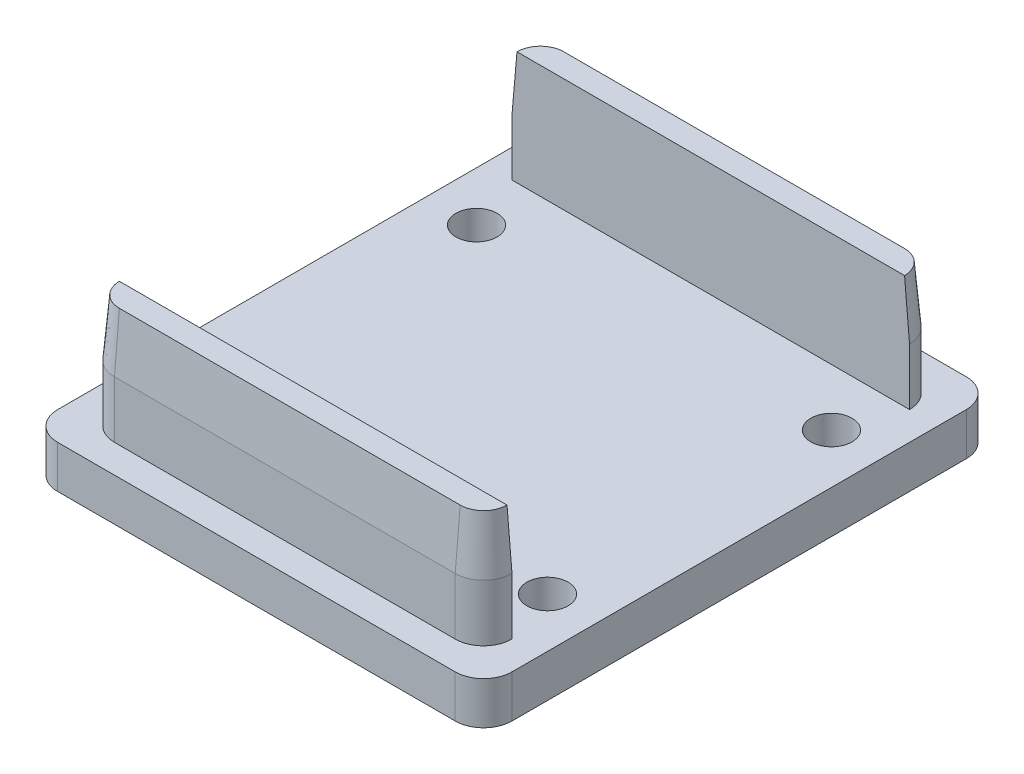
ISO-10303-21;
HEADER;
FILE_DESCRIPTION(('STEP AP214'),'2;1');
FILE_NAME('part.step','',(''),(''),'','','');
FILE_SCHEMA(('AUTOMOTIVE_DESIGN { 1 0 10303 214 1 1 1 1 }'));
ENDSEC;
DATA;
#1=APPLICATION_CONTEXT('core data for automotive mechanical design processes');
#2=APPLICATION_PROTOCOL_DEFINITION('international standard','automotive_design',2000,#1);
#3=PRODUCT_CONTEXT('',#1,'mechanical');
#4=PRODUCT('Part','Part','',(#3));
#5=PRODUCT_RELATED_PRODUCT_CATEGORY('part','',(#4));
#6=PRODUCT_DEFINITION_FORMATION('','',#4);
#7=PRODUCT_DEFINITION_CONTEXT('part definition',#1,'design');
#8=PRODUCT_DEFINITION('design','',#6,#7);
#9=PRODUCT_DEFINITION_SHAPE('','',#8);
#10=(LENGTH_UNIT() NAMED_UNIT(*) SI_UNIT(.MILLI.,.METRE.));
#11=(NAMED_UNIT(*) PLANE_ANGLE_UNIT() SI_UNIT($,.RADIAN.));
#12=(NAMED_UNIT(*) SI_UNIT($,.STERADIAN.) SOLID_ANGLE_UNIT());
#13=UNCERTAINTY_MEASURE_WITH_UNIT(LENGTH_MEASURE(1.E-05),#10,'distance_accuracy_value','');
#14=(GEOMETRIC_REPRESENTATION_CONTEXT(3) GLOBAL_UNCERTAINTY_ASSIGNED_CONTEXT((#13)) GLOBAL_UNIT_ASSIGNED_CONTEXT((#10,
#11,#12)) REPRESENTATION_CONTEXT('',''));
#15=CARTESIAN_POINT('',(0.,0.,0.));
#16=DIRECTION('',(0.,0.,1.));
#17=DIRECTION('',(1.,0.,0.));
#18=AXIS2_PLACEMENT_3D('',#15,#16,#17);
#19=CARTESIAN_POINT('',(0.,3.,0.));
#20=DIRECTION('',(0.,-1.,0.));
#21=DIRECTION('',(0.,0.,-1.));
#22=AXIS2_PLACEMENT_3D('',#19,#20,#21);
#23=PLANE('',#22);
#24=CARTESIAN_POINT('',(12.5,3.,9.99999999999999));
#25=DIRECTION('',(0.,1.,0.));
#26=DIRECTION('',(0.,0.,-1.));
#27=AXIS2_PLACEMENT_3D('',#24,#25,#26);
#28=CIRCLE('',#27,1.45);
#29=CARTESIAN_POINT('',(12.5,3.,8.55));
#30=VERTEX_POINT('',#29);
#31=EDGE_CURVE('E599',#30,#30,#28,.T.);
#32=ORIENTED_EDGE('',*,*,#31,.F.);
#33=EDGE_LOOP('',(#32));
#34=FACE_BOUND('',#33,.T.);
#35=CARTESIAN_POINT('',(12.5,3.,-9.99999999999999));
#36=DIRECTION('',(0.,-1.,0.));
#37=DIRECTION('',(0.,0.,1.));
#38=AXIS2_PLACEMENT_3D('',#35,#36,#37);
#39=CIRCLE('',#38,1.45);
#40=CARTESIAN_POINT('',(12.5,3.,-8.55));
#41=VERTEX_POINT('',#40);
#42=EDGE_CURVE('E598',#41,#41,#39,.T.);
#43=ORIENTED_EDGE('',*,*,#42,.T.);
#44=EDGE_LOOP('',(#43));
#45=FACE_BOUND('',#44,.T.);
#46=CARTESIAN_POINT('',(-12.5,3.,9.99999999999999));
#47=DIRECTION('',(0.,-1.,0.));
#48=DIRECTION('',(0.,0.,-1.));
#49=AXIS2_PLACEMENT_3D('',#46,#47,#48);
#50=CIRCLE('',#49,1.45);
#51=CARTESIAN_POINT('',(-12.5,3.,8.55));
#52=VERTEX_POINT('',#51);
#53=EDGE_CURVE('E400',#52,#52,#50,.T.);
#54=ORIENTED_EDGE('',*,*,#53,.T.);
#55=EDGE_LOOP('',(#54));
#56=FACE_BOUND('',#55,.T.);
#57=CARTESIAN_POINT('',(-12.5,3.,-9.99999999999999));
#58=DIRECTION('',(0.,1.,0.));
#59=DIRECTION('',(0.,0.,1.));
#60=AXIS2_PLACEMENT_3D('',#57,#58,#59);
#61=CIRCLE('',#60,1.45);
#62=CARTESIAN_POINT('',(-12.5,3.,-8.55));
#63=VERTEX_POINT('',#62);
#64=EDGE_CURVE('E391',#63,#63,#61,.T.);
#65=ORIENTED_EDGE('',*,*,#64,.F.);
#66=EDGE_LOOP('',(#65));
#67=FACE_BOUND('',#66,.T.);
#68=DIRECTION('',(-1.,0.,0.));
#69=VECTOR('',#68,1.);
#70=CARTESIAN_POINT('',(14.,3.,-16.));
#71=LINE('',#70,#69);
#72=CARTESIAN_POINT('',(12.,3.,-16.));
#73=VERTEX_POINT('',#72);
#74=CARTESIAN_POINT('',(-12.,3.,-16.));
#75=VERTEX_POINT('',#74);
#76=EDGE_CURVE('E207',#73,#75,#71,.T.);
#77=ORIENTED_EDGE('',*,*,#76,.F.);
#78=CARTESIAN_POINT('',(12.,3.,-14.));
#79=DIRECTION('',(0.,-1.,0.));
#80=DIRECTION('',(0.,0.,-1.));
#81=AXIS2_PLACEMENT_3D('',#78,#79,#80);
#82=CIRCLE('',#81,2.);
#83=CARTESIAN_POINT('',(14.,3.,-14.));
#84=VERTEX_POINT('',#83);
#85=EDGE_CURVE('E192',#73,#84,#82,.T.);
#86=ORIENTED_EDGE('',*,*,#85,.T.);
#87=DIRECTION('',(1.,0.,0.));
#88=VECTOR('',#87,1.);
#89=CARTESIAN_POINT('',(-14.,3.,-14.));
#90=LINE('',#89,#88);
#91=CARTESIAN_POINT('',(-14.,3.,-14.));
#92=VERTEX_POINT('',#91);
#93=EDGE_CURVE('E205',#92,#84,#90,.T.);
#94=ORIENTED_EDGE('',*,*,#93,.F.);
#95=CARTESIAN_POINT('',(-12.,3.,-14.));
#96=DIRECTION('',(0.,-1.,0.));
#97=DIRECTION('',(0.,0.,-1.));
#98=AXIS2_PLACEMENT_3D('',#95,#96,#97);
#99=CIRCLE('',#98,2.);
#100=EDGE_CURVE('E210',#92,#75,#99,.T.);
#101=ORIENTED_EDGE('',*,*,#100,.T.);
#102=EDGE_LOOP('',(#77,#86,#94,#101));
#103=FACE_BOUND('',#102,.T.);
#104=DIRECTION('',(0.,0.,1.));
#105=VECTOR('',#104,1.);
#106=CARTESIAN_POINT('',(-16.,3.,18.));
#107=LINE('',#106,#105);
#108=CARTESIAN_POINT('',(-16.,3.,-16.));
#109=VERTEX_POINT('',#108);
#110=CARTESIAN_POINT('',(-16.,3.,16.));
#111=VERTEX_POINT('',#110);
#112=EDGE_CURVE('E233',#109,#111,#107,.T.);
#113=ORIENTED_EDGE('',*,*,#112,.T.);
#114=CARTESIAN_POINT('',(-14.,3.,16.));
#115=DIRECTION('',(0.,-1.,0.));
#116=DIRECTION('',(0.,0.,-1.));
#117=AXIS2_PLACEMENT_3D('',#114,#115,#116);
#118=CIRCLE('',#117,2.);
#119=CARTESIAN_POINT('',(-14.,3.,18.));
#120=VERTEX_POINT('',#119);
#121=EDGE_CURVE('E305',#111,#120,#118,.F.);
#122=ORIENTED_EDGE('',*,*,#121,.T.);
#123=DIRECTION('',(1.,0.,0.));
#124=VECTOR('',#123,1.);
#125=CARTESIAN_POINT('',(-16.,3.,18.));
#126=LINE('',#125,#124);
#127=CARTESIAN_POINT('',(14.,3.,18.));
#128=VERTEX_POINT('',#127);
#129=EDGE_CURVE('E237',#120,#128,#126,.T.);
#130=ORIENTED_EDGE('',*,*,#129,.T.);
#131=CARTESIAN_POINT('',(14.,3.,16.));
#132=DIRECTION('',(0.,-1.,0.));
#133=DIRECTION('',(0.,0.,-1.));
#134=AXIS2_PLACEMENT_3D('',#131,#132,#133);
#135=CIRCLE('',#134,2.);
#136=CARTESIAN_POINT('',(16.,3.,16.));
#137=VERTEX_POINT('',#136);
#138=EDGE_CURVE('E302',#128,#137,#135,.F.);
#139=ORIENTED_EDGE('',*,*,#138,.T.);
#140=DIRECTION('',(0.,0.,-1.));
#141=VECTOR('',#140,1.);
#142=CARTESIAN_POINT('',(16.,3.,18.));
#143=LINE('',#142,#141);
#144=CARTESIAN_POINT('',(16.,3.,-16.));
#145=VERTEX_POINT('',#144);
#146=EDGE_CURVE('E224',#137,#145,#143,.T.);
#147=ORIENTED_EDGE('',*,*,#146,.T.);
#148=CARTESIAN_POINT('',(14.,3.,-16.));
#149=DIRECTION('',(0.,-1.,0.));
#150=DIRECTION('',(0.,0.,-1.));
#151=AXIS2_PLACEMENT_3D('',#148,#149,#150);
#152=CIRCLE('',#151,2.);
#153=CARTESIAN_POINT('',(14.,3.,-18.));
#154=VERTEX_POINT('',#153);
#155=EDGE_CURVE('E296',#145,#154,#152,.F.);
#156=ORIENTED_EDGE('',*,*,#155,.T.);
#157=DIRECTION('',(-1.,0.,0.));
#158=VECTOR('',#157,1.);
#159=CARTESIAN_POINT('',(-16.,3.,-18.));
#160=LINE('',#159,#158);
#161=CARTESIAN_POINT('',(-14.,3.,-18.));
#162=VERTEX_POINT('',#161);
#163=EDGE_CURVE('E228',#154,#162,#160,.T.);
#164=ORIENTED_EDGE('',*,*,#163,.T.);
#165=CARTESIAN_POINT('',(-14.,3.,-16.));
#166=DIRECTION('',(0.,-1.,0.));
#167=DIRECTION('',(0.,0.,-1.));
#168=AXIS2_PLACEMENT_3D('',#165,#166,#167);
#169=CIRCLE('',#168,2.);
#170=EDGE_CURVE('E299',#162,#109,#169,.F.);
#171=ORIENTED_EDGE('',*,*,#170,.T.);
#172=EDGE_LOOP('',(#113,#122,#130,#139,#147,#156,#164,#171));
#173=FACE_BOUND('',#172,.T.);
#174=DIRECTION('',(-1.,0.,0.));
#175=VECTOR('',#174,1.);
#176=CARTESIAN_POINT('',(-14.,3.,14.));
#177=LINE('',#176,#175);
#178=CARTESIAN_POINT('',(14.,3.,14.));
#179=VERTEX_POINT('',#178);
#180=CARTESIAN_POINT('',(-14.,3.,14.));
#181=VERTEX_POINT('',#180);
#182=EDGE_CURVE('E218',#179,#181,#177,.T.);
#183=ORIENTED_EDGE('',*,*,#182,.F.);
#184=CARTESIAN_POINT('',(12.,3.,14.));
#185=DIRECTION('',(0.,-1.,0.));
#186=DIRECTION('',(0.,0.,-1.));
#187=AXIS2_PLACEMENT_3D('',#184,#185,#186);
#188=CIRCLE('',#187,2.);
#189=CARTESIAN_POINT('',(12.,3.,16.));
#190=VERTEX_POINT('',#189);
#191=EDGE_CURVE('E209',#179,#190,#188,.T.);
#192=ORIENTED_EDGE('',*,*,#191,.T.);
#193=DIRECTION('',(1.,0.,0.));
#194=VECTOR('',#193,1.);
#195=CARTESIAN_POINT('',(-14.,3.,16.));
#196=LINE('',#195,#194);
#197=CARTESIAN_POINT('',(-12.,3.,16.));
#198=VERTEX_POINT('',#197);
#199=EDGE_CURVE('E408',#198,#190,#196,.T.);
#200=ORIENTED_EDGE('',*,*,#199,.F.);
#201=CARTESIAN_POINT('',(-12.,3.,14.));
#202=DIRECTION('',(0.,-1.,0.));
#203=DIRECTION('',(0.,0.,-1.));
#204=AXIS2_PLACEMENT_3D('',#201,#202,#203);
#205=CIRCLE('',#204,2.);
#206=EDGE_CURVE('E322',#198,#181,#205,.T.);
#207=ORIENTED_EDGE('',*,*,#206,.T.);
#208=EDGE_LOOP('',(#183,#192,#200,#207));
#209=FACE_BOUND('',#208,.T.);
#210=ADVANCED_FACE('F47',(#34,#45,#56,#67,#103,#173,#209),#23,.F.);
#211=CARTESIAN_POINT('',(16.,3.,18.));
#212=DIRECTION('',(-1.,0.,0.));
#213=DIRECTION('',(0.,0.,1.));
#214=AXIS2_PLACEMENT_3D('',#211,#212,#213);
#215=PLANE('',#214);
#216=ORIENTED_EDGE('',*,*,#146,.F.);
#217=DIRECTION('',(0.,-1.,0.));
#218=VECTOR('',#217,1.);
#219=CARTESIAN_POINT('',(16.,3.,16.));
#220=LINE('',#219,#218);
#221=CARTESIAN_POINT('',(16.,0.,16.));
#222=VERTEX_POINT('',#221);
#223=EDGE_CURVE('E311',#137,#222,#220,.T.);
#224=ORIENTED_EDGE('',*,*,#223,.T.);
#225=DIRECTION('',(0.,0.,-1.));
#226=VECTOR('',#225,1.);
#227=CARTESIAN_POINT('',(16.,0.,18.));
#228=LINE('',#227,#226);
#229=CARTESIAN_POINT('',(16.,0.,-16.));
#230=VERTEX_POINT('',#229);
#231=EDGE_CURVE('E242',#222,#230,#228,.T.);
#232=ORIENTED_EDGE('',*,*,#231,.T.);
#233=DIRECTION('',(0.,-1.,0.));
#234=VECTOR('',#233,1.);
#235=CARTESIAN_POINT('',(16.,3.,-16.));
#236=LINE('',#235,#234);
#237=EDGE_CURVE('E308',#230,#145,#236,.F.);
#238=ORIENTED_EDGE('',*,*,#237,.T.);
#239=EDGE_LOOP('',(#216,#224,#232,#238));
#240=FACE_BOUND('',#239,.T.);
#241=ADVANCED_FACE('F466',(#240),#215,.F.);
#242=CARTESIAN_POINT('',(-16.,3.,-18.));
#243=DIRECTION('',(0.,0.,1.));
#244=DIRECTION('',(1.,0.,0.));
#245=AXIS2_PLACEMENT_3D('',#242,#243,#244);
#246=PLANE('',#245);
#247=DIRECTION('',(-1.,0.,0.));
#248=VECTOR('',#247,1.);
#249=CARTESIAN_POINT('',(-16.,0.,-18.));
#250=LINE('',#249,#248);
#251=CARTESIAN_POINT('',(14.,0.,-18.));
#252=VERTEX_POINT('',#251);
#253=CARTESIAN_POINT('',(-14.,0.,-18.));
#254=VERTEX_POINT('',#253);
#255=EDGE_CURVE('E246',#252,#254,#250,.T.);
#256=ORIENTED_EDGE('',*,*,#255,.T.);
#257=DIRECTION('',(0.,-1.,0.));
#258=VECTOR('',#257,1.);
#259=CARTESIAN_POINT('',(-14.,3.,-18.));
#260=LINE('',#259,#258);
#261=EDGE_CURVE('E319',#254,#162,#260,.F.);
#262=ORIENTED_EDGE('',*,*,#261,.T.);
#263=ORIENTED_EDGE('',*,*,#163,.F.);
#264=DIRECTION('',(0.,-1.,0.));
#265=VECTOR('',#264,1.);
#266=CARTESIAN_POINT('',(14.,3.,-18.));
#267=LINE('',#266,#265);
#268=EDGE_CURVE('E315',#154,#252,#267,.T.);
#269=ORIENTED_EDGE('',*,*,#268,.T.);
#270=EDGE_LOOP('',(#256,#262,#263,#269));
#271=FACE_BOUND('',#270,.T.);
#272=ADVANCED_FACE('F474',(#271),#246,.F.);
#273=CARTESIAN_POINT('',(-16.,3.,18.));
#274=DIRECTION('',(1.,0.,0.));
#275=DIRECTION('',(0.,0.,-1.));
#276=AXIS2_PLACEMENT_3D('',#273,#274,#275);
#277=PLANE('',#276);
#278=DIRECTION('',(0.,0.,1.));
#279=VECTOR('',#278,1.);
#280=CARTESIAN_POINT('',(-16.,0.,18.));
#281=LINE('',#280,#279);
#282=CARTESIAN_POINT('',(-16.,0.,-16.));
#283=VERTEX_POINT('',#282);
#284=CARTESIAN_POINT('',(-16.,0.,16.));
#285=VERTEX_POINT('',#284);
#286=EDGE_CURVE('E251',#283,#285,#281,.T.);
#287=ORIENTED_EDGE('',*,*,#286,.T.);
#288=DIRECTION('',(0.,-1.,0.));
#289=VECTOR('',#288,1.);
#290=CARTESIAN_POINT('',(-16.,3.,16.));
#291=LINE('',#290,#289);
#292=EDGE_CURVE('E293',#285,#111,#291,.F.);
#293=ORIENTED_EDGE('',*,*,#292,.T.);
#294=ORIENTED_EDGE('',*,*,#112,.F.);
#295=DIRECTION('',(0.,-1.,0.));
#296=VECTOR('',#295,1.);
#297=CARTESIAN_POINT('',(-16.,3.,-16.));
#298=LINE('',#297,#296);
#299=EDGE_CURVE('E289',#109,#283,#298,.T.);
#300=ORIENTED_EDGE('',*,*,#299,.T.);
#301=EDGE_LOOP('',(#287,#293,#294,#300));
#302=FACE_BOUND('',#301,.T.);
#303=ADVANCED_FACE('F491',(#302),#277,.F.);
#304=CARTESIAN_POINT('',(-16.,3.,18.));
#305=DIRECTION('',(0.,0.,-1.));
#306=DIRECTION('',(-1.,0.,0.));
#307=AXIS2_PLACEMENT_3D('',#304,#305,#306);
#308=PLANE('',#307);
#309=ORIENTED_EDGE('',*,*,#129,.F.);
#310=DIRECTION('',(0.,-1.,0.));
#311=VECTOR('',#310,1.);
#312=CARTESIAN_POINT('',(-14.,3.,18.));
#313=LINE('',#312,#311);
#314=CARTESIAN_POINT('',(-14.,0.,18.));
#315=VERTEX_POINT('',#314);
#316=EDGE_CURVE('E273',#120,#315,#313,.T.);
#317=ORIENTED_EDGE('',*,*,#316,.T.);
#318=DIRECTION('',(1.,0.,0.));
#319=VECTOR('',#318,1.);
#320=CARTESIAN_POINT('',(-16.,0.,18.));
#321=LINE('',#320,#319);
#322=CARTESIAN_POINT('',(14.,0.,18.));
#323=VERTEX_POINT('',#322);
#324=EDGE_CURVE('E229',#315,#323,#321,.T.);
#325=ORIENTED_EDGE('',*,*,#324,.T.);
#326=DIRECTION('',(0.,-1.,0.));
#327=VECTOR('',#326,1.);
#328=CARTESIAN_POINT('',(14.,3.,18.));
#329=LINE('',#328,#327);
#330=EDGE_CURVE('E270',#323,#128,#329,.F.);
#331=ORIENTED_EDGE('',*,*,#330,.T.);
#332=EDGE_LOOP('',(#309,#317,#325,#331));
#333=FACE_BOUND('',#332,.T.);
#334=ADVANCED_FACE('F487',(#333),#308,.F.);
#335=CARTESIAN_POINT('',(0.,0.,0.));
#336=DIRECTION('',(0.,-1.,0.));
#337=DIRECTION('',(0.,0.,-1.));
#338=AXIS2_PLACEMENT_3D('',#335,#336,#337);
#339=PLANE('',#338);
#340=ORIENTED_EDGE('',*,*,#324,.F.);
#341=CARTESIAN_POINT('',(-14.,0.,16.));
#342=DIRECTION('',(0.,-1.,0.));
#343=DIRECTION('',(0.,0.,-1.));
#344=AXIS2_PLACEMENT_3D('',#341,#342,#343);
#345=CIRCLE('',#344,2.);
#346=EDGE_CURVE('E286',#315,#285,#345,.T.);
#347=ORIENTED_EDGE('',*,*,#346,.T.);
#348=ORIENTED_EDGE('',*,*,#286,.F.);
#349=CARTESIAN_POINT('',(-14.,0.,-16.));
#350=DIRECTION('',(0.,-1.,0.));
#351=DIRECTION('',(0.,0.,-1.));
#352=AXIS2_PLACEMENT_3D('',#349,#350,#351);
#353=CIRCLE('',#352,2.);
#354=EDGE_CURVE('E280',#283,#254,#353,.T.);
#355=ORIENTED_EDGE('',*,*,#354,.T.);
#356=ORIENTED_EDGE('',*,*,#255,.F.);
#357=CARTESIAN_POINT('',(14.,0.,-16.));
#358=DIRECTION('',(0.,-1.,0.));
#359=DIRECTION('',(0.,0.,-1.));
#360=AXIS2_PLACEMENT_3D('',#357,#358,#359);
#361=CIRCLE('',#360,2.);
#362=EDGE_CURVE('E277',#252,#230,#361,.T.);
#363=ORIENTED_EDGE('',*,*,#362,.T.);
#364=ORIENTED_EDGE('',*,*,#231,.F.);
#365=CARTESIAN_POINT('',(14.,0.,16.));
#366=DIRECTION('',(0.,-1.,0.));
#367=DIRECTION('',(0.,0.,-1.));
#368=AXIS2_PLACEMENT_3D('',#365,#366,#367);
#369=CIRCLE('',#368,2.);
#370=EDGE_CURVE('E283',#222,#323,#369,.T.);
#371=ORIENTED_EDGE('',*,*,#370,.T.);
#372=EDGE_LOOP('',(#340,#347,#348,#355,#356,#363,#364,#371));
#373=FACE_BOUND('',#372,.T.);
#374=ADVANCED_FACE('F483',(#373),#339,.T.);
#375=CARTESIAN_POINT('',(14.,11.,-16.));
#376=DIRECTION('',(0.,0.,1.));
#377=DIRECTION('',(1.,0.,0.));
#378=AXIS2_PLACEMENT_3D('',#375,#376,#377);
#379=PLANE('',#378);
#380=DIRECTION('',(0.,-1.,0.));
#381=VECTOR('',#380,1.);
#382=CARTESIAN_POINT('',(-12.,11.,-16.));
#383=LINE('',#382,#381);
#384=CARTESIAN_POINT('',(-12.,6.99999999999984,-16.));
#385=VERTEX_POINT('',#384);
#386=EDGE_CURVE('E267',#75,#385,#383,.F.);
#387=ORIENTED_EDGE('',*,*,#386,.T.);
#388=DIRECTION('',(1.,0.,0.));
#389=VECTOR('',#388,1.);
#390=CARTESIAN_POINT('',(12.,6.99999999999984,-16.));
#391=LINE('',#390,#389);
#392=CARTESIAN_POINT('',(12.,6.99999999999984,-16.));
#393=VERTEX_POINT('',#392);
#394=EDGE_CURVE('E11',#385,#393,#391,.T.);
#395=ORIENTED_EDGE('',*,*,#394,.T.);
#396=DIRECTION('',(0.,-1.,0.));
#397=VECTOR('',#396,1.);
#398=CARTESIAN_POINT('',(12.,11.,-16.));
#399=LINE('',#398,#397);
#400=EDGE_CURVE('E264',#393,#73,#399,.T.);
#401=ORIENTED_EDGE('',*,*,#400,.T.);
#402=ORIENTED_EDGE('',*,*,#76,.T.);
#403=EDGE_LOOP('',(#387,#395,#401,#402));
#404=FACE_BOUND('',#403,.T.);
#405=ADVANCED_FACE('F486',(#404),#379,.F.);
#406=CARTESIAN_POINT('',(-14.,11.,-14.));
#407=DIRECTION('',(0.,0.,-1.));
#408=DIRECTION('',(-1.,0.,0.));
#409=AXIS2_PLACEMENT_3D('',#406,#407,#408);
#410=PLANE('',#409);
#411=DIRECTION('',(0.,-1.,0.));
#412=VECTOR('',#411,1.);
#413=CARTESIAN_POINT('',(14.,11.,-14.));
#414=LINE('',#413,#412);
#415=CARTESIAN_POINT('',(14.,6.99999999999984,-14.));
#416=VERTEX_POINT('',#415);
#417=EDGE_CURVE('E188',#416,#84,#414,.T.);
#418=ORIENTED_EDGE('',*,*,#417,.F.);
#419=DIRECTION('',(0.0871557427476551,-0.996194698091746,0.));
#420=VECTOR('',#419,1.);
#421=CARTESIAN_POINT('',(12.,29.8601046055233,-14.));
#422=LINE('',#421,#420);
#423=CARTESIAN_POINT('',(13.6500453458963,11.,-14.));
#424=VERTEX_POINT('',#423);
#425=EDGE_CURVE('E369',#416,#424,#422,.F.);
#426=ORIENTED_EDGE('',*,*,#425,.T.);
#427=DIRECTION('',(1.,0.,0.));
#428=VECTOR('',#427,1.);
#429=CARTESIAN_POINT('',(-14.,11.,-14.));
#430=LINE('',#429,#428);
#431=CARTESIAN_POINT('',(-13.6500453458963,11.,-14.));
#432=VERTEX_POINT('',#431);
#433=EDGE_CURVE('E199',#432,#424,#430,.T.);
#434=ORIENTED_EDGE('',*,*,#433,.F.);
#435=DIRECTION('',(0.0871557427476551,0.996194698091746,0.));
#436=VECTOR('',#435,1.);
#437=CARTESIAN_POINT('',(-12.,29.8601046055233,-14.));
#438=LINE('',#437,#436);
#439=CARTESIAN_POINT('',(-14.,6.99999999999984,-14.));
#440=VERTEX_POINT('',#439);
#441=EDGE_CURVE('E73',#432,#440,#438,.F.);
#442=ORIENTED_EDGE('',*,*,#441,.T.);
#443=DIRECTION('',(0.,-1.,0.));
#444=VECTOR('',#443,1.);
#445=CARTESIAN_POINT('',(-14.,11.,-14.));
#446=LINE('',#445,#444);
#447=EDGE_CURVE('E200',#440,#92,#446,.T.);
#448=ORIENTED_EDGE('',*,*,#447,.T.);
#449=ORIENTED_EDGE('',*,*,#93,.T.);
#450=EDGE_LOOP('',(#418,#426,#434,#442,#448,#449));
#451=FACE_BOUND('',#450,.T.);
#452=ADVANCED_FACE('F212',(#451),#410,.F.);
#453=CARTESIAN_POINT('',(0.,11.,0.));
#454=DIRECTION('',(0.,1.,0.));
#455=DIRECTION('',(0.,0.,1.));
#456=AXIS2_PLACEMENT_3D('',#453,#454,#455);
#457=PLANE('',#456);
#458=ORIENTED_EDGE('',*,*,#433,.T.);
#459=CARTESIAN_POINT('',(12.,11.,-14.));
#460=DIRECTION('',(0.,1.,0.));
#461=DIRECTION('',(0.,0.,1.));
#462=AXIS2_PLACEMENT_3D('',#459,#460,#461);
#463=CIRCLE('',#462,1.6500453458963);
#464=CARTESIAN_POINT('',(12.,11.,-15.6500453458963));
#465=VERTEX_POINT('',#464);
#466=EDGE_CURVE('E361',#424,#465,#463,.T.);
#467=ORIENTED_EDGE('',*,*,#466,.T.);
#468=DIRECTION('',(-1.,0.,0.));
#469=VECTOR('',#468,1.);
#470=CARTESIAN_POINT('',(-12.,11.,-15.6500453458963));
#471=LINE('',#470,#469);
#472=CARTESIAN_POINT('',(-12.,11.,-15.6500453458963));
#473=VERTEX_POINT('',#472);
#474=EDGE_CURVE('E355',#465,#473,#471,.T.);
#475=ORIENTED_EDGE('',*,*,#474,.T.);
#476=CARTESIAN_POINT('',(-12.,11.,-14.));
#477=DIRECTION('',(0.,1.,0.));
#478=DIRECTION('',(0.,0.,1.));
#479=AXIS2_PLACEMENT_3D('',#476,#477,#478);
#480=CIRCLE('',#479,1.6500453458963);
#481=EDGE_CURVE('E358',#473,#432,#480,.T.);
#482=ORIENTED_EDGE('',*,*,#481,.T.);
#483=EDGE_LOOP('',(#458,#467,#475,#482));
#484=FACE_BOUND('',#483,.T.);
#485=ADVANCED_FACE('F481',(#484),#457,.T.);
#486=CARTESIAN_POINT('',(-14.,11.,14.));
#487=DIRECTION('',(0.,0.,1.));
#488=DIRECTION('',(1.,0.,0.));
#489=AXIS2_PLACEMENT_3D('',#486,#487,#488);
#490=PLANE('',#489);
#491=DIRECTION('',(0.,-1.,0.));
#492=VECTOR('',#491,1.);
#493=CARTESIAN_POINT('',(-14.,11.,14.));
#494=LINE('',#493,#492);
#495=CARTESIAN_POINT('',(-14.,6.99999999999986,14.));
#496=VERTEX_POINT('',#495);
#497=EDGE_CURVE('E407',#496,#181,#494,.T.);
#498=ORIENTED_EDGE('',*,*,#497,.F.);
#499=DIRECTION('',(-0.0871557427476547,-0.996194698091746,0.));
#500=VECTOR('',#499,1.);
#501=CARTESIAN_POINT('',(-12.,29.8601046055235,14.));
#502=LINE('',#501,#500);
#503=CARTESIAN_POINT('',(-13.6500453458963,11.,14.));
#504=VERTEX_POINT('',#503);
#505=EDGE_CURVE('E346',#496,#504,#502,.F.);
#506=ORIENTED_EDGE('',*,*,#505,.T.);
#507=DIRECTION('',(-1.,0.,0.));
#508=VECTOR('',#507,1.);
#509=CARTESIAN_POINT('',(-14.,11.,14.));
#510=LINE('',#509,#508);
#511=CARTESIAN_POINT('',(13.6500453458963,11.,14.));
#512=VERTEX_POINT('',#511);
#513=EDGE_CURVE('E403',#512,#504,#510,.T.);
#514=ORIENTED_EDGE('',*,*,#513,.F.);
#515=DIRECTION('',(-0.0871557427476547,0.996194698091746,0.));
#516=VECTOR('',#515,1.);
#517=CARTESIAN_POINT('',(12.,29.8601046055235,14.));
#518=LINE('',#517,#516);
#519=CARTESIAN_POINT('',(14.,6.99999999999986,14.));
#520=VERTEX_POINT('',#519);
#521=EDGE_CURVE('E343',#512,#520,#518,.F.);
#522=ORIENTED_EDGE('',*,*,#521,.T.);
#523=DIRECTION('',(0.,-1.,0.));
#524=VECTOR('',#523,1.);
#525=CARTESIAN_POINT('',(14.,11.,14.));
#526=LINE('',#525,#524);
#527=EDGE_CURVE('E247',#520,#179,#526,.T.);
#528=ORIENTED_EDGE('',*,*,#527,.T.);
#529=ORIENTED_EDGE('',*,*,#182,.T.);
#530=EDGE_LOOP('',(#498,#506,#514,#522,#528,#529));
#531=FACE_BOUND('',#530,.T.);
#532=ADVANCED_FACE('F423',(#531),#490,.F.);
#533=CARTESIAN_POINT('',(-14.,11.,16.));
#534=DIRECTION('',(0.,0.,-1.));
#535=DIRECTION('',(-1.,0.,0.));
#536=AXIS2_PLACEMENT_3D('',#533,#534,#535);
#537=PLANE('',#536);
#538=DIRECTION('',(0.,-1.,0.));
#539=VECTOR('',#538,1.);
#540=CARTESIAN_POINT('',(12.,11.,16.));
#541=LINE('',#540,#539);
#542=CARTESIAN_POINT('',(12.,6.99999999999986,16.));
#543=VERTEX_POINT('',#542);
#544=EDGE_CURVE('E241',#190,#543,#541,.F.);
#545=ORIENTED_EDGE('',*,*,#544,.T.);
#546=DIRECTION('',(-1.,0.,0.));
#547=VECTOR('',#546,1.);
#548=CARTESIAN_POINT('',(-12.,6.99999999999986,16.));
#549=LINE('',#548,#547);
#550=CARTESIAN_POINT('',(-12.,6.99999999999986,16.));
#551=VERTEX_POINT('',#550);
#552=EDGE_CURVE('E352',#543,#551,#549,.T.);
#553=ORIENTED_EDGE('',*,*,#552,.T.);
#554=DIRECTION('',(0.,-1.,0.));
#555=VECTOR('',#554,1.);
#556=CARTESIAN_POINT('',(-12.,11.,16.));
#557=LINE('',#556,#555);
#558=EDGE_CURVE('E261',#551,#198,#557,.T.);
#559=ORIENTED_EDGE('',*,*,#558,.T.);
#560=ORIENTED_EDGE('',*,*,#199,.T.);
#561=EDGE_LOOP('',(#545,#553,#559,#560));
#562=FACE_BOUND('',#561,.T.);
#563=ADVANCED_FACE('F452',(#562),#537,.F.);
#564=CARTESIAN_POINT('',(0.,11.,0.));
#565=DIRECTION('',(0.,1.,0.));
#566=DIRECTION('',(0.,0.,1.));
#567=AXIS2_PLACEMENT_3D('',#564,#565,#566);
#568=PLANE('',#567);
#569=ORIENTED_EDGE('',*,*,#513,.T.);
#570=CARTESIAN_POINT('',(-12.,11.,14.));
#571=DIRECTION('',(0.,1.,0.));
#572=DIRECTION('',(0.,0.,1.));
#573=AXIS2_PLACEMENT_3D('',#570,#571,#572);
#574=CIRCLE('',#573,1.65004534589631);
#575=CARTESIAN_POINT('',(-12.,11.,15.6500453458963));
#576=VERTEX_POINT('',#575);
#577=EDGE_CURVE('E336',#504,#576,#574,.T.);
#578=ORIENTED_EDGE('',*,*,#577,.T.);
#579=DIRECTION('',(1.,0.,0.));
#580=VECTOR('',#579,1.);
#581=CARTESIAN_POINT('',(12.,11.,15.6500453458963));
#582=LINE('',#581,#580);
#583=CARTESIAN_POINT('',(12.,11.,15.6500453458963));
#584=VERTEX_POINT('',#583);
#585=EDGE_CURVE('E330',#576,#584,#582,.T.);
#586=ORIENTED_EDGE('',*,*,#585,.T.);
#587=CARTESIAN_POINT('',(12.,11.,14.));
#588=DIRECTION('',(0.,1.,0.));
#589=DIRECTION('',(0.,0.,1.));
#590=AXIS2_PLACEMENT_3D('',#587,#588,#589);
#591=CIRCLE('',#590,1.65004534589631);
#592=EDGE_CURVE('E333',#584,#512,#591,.T.);
#593=ORIENTED_EDGE('',*,*,#592,.T.);
#594=EDGE_LOOP('',(#569,#578,#586,#593));
#595=FACE_BOUND('',#594,.T.);
#596=ADVANCED_FACE('F445',(#595),#568,.T.);
#597=CARTESIAN_POINT('',(-12.,11.,14.));
#598=DIRECTION('',(0.,-1.,0.));
#599=DIRECTION('',(0.,0.,-1.));
#600=AXIS2_PLACEMENT_3D('',#597,#598,#599);
#601=CYLINDRICAL_SURFACE('',#600,2.);
#602=ORIENTED_EDGE('',*,*,#558,.F.);
#603=CARTESIAN_POINT('',(-12.,6.99999999999986,14.));
#604=DIRECTION('',(0.,1.,0.));
#605=DIRECTION('',(0.,0.,1.));
#606=AXIS2_PLACEMENT_3D('',#603,#604,#605);
#607=CIRCLE('',#606,2.);
#608=EDGE_CURVE('E340',#551,#496,#607,.F.);
#609=ORIENTED_EDGE('',*,*,#608,.T.);
#610=ORIENTED_EDGE('',*,*,#497,.T.);
#611=ORIENTED_EDGE('',*,*,#206,.F.);
#612=EDGE_LOOP('',(#602,#609,#610,#611));
#613=FACE_BOUND('',#612,.T.);
#614=ADVANCED_FACE('F436',(#613),#601,.T.);
#615=CARTESIAN_POINT('',(-12.,11.,-14.));
#616=DIRECTION('',(0.,-1.,0.));
#617=DIRECTION('',(0.,0.,-1.));
#618=AXIS2_PLACEMENT_3D('',#615,#616,#617);
#619=CYLINDRICAL_SURFACE('',#618,2.);
#620=ORIENTED_EDGE('',*,*,#447,.F.);
#621=CARTESIAN_POINT('',(-12.,6.99999999999984,-14.));
#622=DIRECTION('',(0.,1.,0.));
#623=DIRECTION('',(0.,0.,1.));
#624=AXIS2_PLACEMENT_3D('',#621,#622,#623);
#625=CIRCLE('',#624,2.);
#626=EDGE_CURVE('E58',#440,#385,#625,.F.);
#627=ORIENTED_EDGE('',*,*,#626,.T.);
#628=ORIENTED_EDGE('',*,*,#386,.F.);
#629=ORIENTED_EDGE('',*,*,#100,.F.);
#630=EDGE_LOOP('',(#620,#627,#628,#629));
#631=FACE_BOUND('',#630,.T.);
#632=ADVANCED_FACE('F501',(#631),#619,.T.);
#633=CARTESIAN_POINT('',(12.,11.,-14.));
#634=DIRECTION('',(0.,-1.,0.));
#635=DIRECTION('',(0.,0.,-1.));
#636=AXIS2_PLACEMENT_3D('',#633,#634,#635);
#637=CYLINDRICAL_SURFACE('',#636,2.);
#638=ORIENTED_EDGE('',*,*,#400,.F.);
#639=CARTESIAN_POINT('',(12.,6.99999999999984,-14.));
#640=DIRECTION('',(0.,1.,0.));
#641=DIRECTION('',(0.,0.,1.));
#642=AXIS2_PLACEMENT_3D('',#639,#640,#641);
#643=CIRCLE('',#642,2.);
#644=EDGE_CURVE('E195',#393,#416,#643,.F.);
#645=ORIENTED_EDGE('',*,*,#644,.T.);
#646=ORIENTED_EDGE('',*,*,#417,.T.);
#647=ORIENTED_EDGE('',*,*,#85,.F.);
#648=EDGE_LOOP('',(#638,#645,#646,#647));
#649=FACE_BOUND('',#648,.T.);
#650=ADVANCED_FACE('F191',(#649),#637,.T.);
#651=CARTESIAN_POINT('',(12.,11.,14.));
#652=DIRECTION('',(0.,-1.,0.));
#653=DIRECTION('',(0.,0.,-1.));
#654=AXIS2_PLACEMENT_3D('',#651,#652,#653);
#655=CYLINDRICAL_SURFACE('',#654,2.);
#656=ORIENTED_EDGE('',*,*,#527,.F.);
#657=CARTESIAN_POINT('',(12.,6.99999999999986,14.));
#658=DIRECTION('',(0.,1.,0.));
#659=DIRECTION('',(0.,0.,1.));
#660=AXIS2_PLACEMENT_3D('',#657,#658,#659);
#661=CIRCLE('',#660,2.);
#662=EDGE_CURVE('E349',#520,#543,#661,.F.);
#663=ORIENTED_EDGE('',*,*,#662,.T.);
#664=ORIENTED_EDGE('',*,*,#544,.F.);
#665=ORIENTED_EDGE('',*,*,#191,.F.);
#666=EDGE_LOOP('',(#656,#663,#664,#665));
#667=FACE_BOUND('',#666,.T.);
#668=ADVANCED_FACE('F430',(#667),#655,.T.);
#669=CARTESIAN_POINT('',(-14.,3.,16.));
#670=DIRECTION('',(0.,-1.,0.));
#671=DIRECTION('',(0.,0.,-1.));
#672=AXIS2_PLACEMENT_3D('',#669,#670,#671);
#673=CYLINDRICAL_SURFACE('',#672,2.);
#674=ORIENTED_EDGE('',*,*,#121,.F.);
#675=ORIENTED_EDGE('',*,*,#292,.F.);
#676=ORIENTED_EDGE('',*,*,#346,.F.);
#677=ORIENTED_EDGE('',*,*,#316,.F.);
#678=EDGE_LOOP('',(#674,#675,#676,#677));
#679=FACE_BOUND('',#678,.T.);
#680=ADVANCED_FACE('F508',(#679),#673,.T.);
#681=CARTESIAN_POINT('',(14.,3.,16.));
#682=DIRECTION('',(0.,-1.,0.));
#683=DIRECTION('',(0.,0.,-1.));
#684=AXIS2_PLACEMENT_3D('',#681,#682,#683);
#685=CYLINDRICAL_SURFACE('',#684,2.);
#686=ORIENTED_EDGE('',*,*,#138,.F.);
#687=ORIENTED_EDGE('',*,*,#330,.F.);
#688=ORIENTED_EDGE('',*,*,#370,.F.);
#689=ORIENTED_EDGE('',*,*,#223,.F.);
#690=EDGE_LOOP('',(#686,#687,#688,#689));
#691=FACE_BOUND('',#690,.T.);
#692=ADVANCED_FACE('F511',(#691),#685,.T.);
#693=CARTESIAN_POINT('',(-14.,3.,-16.));
#694=DIRECTION('',(0.,-1.,0.));
#695=DIRECTION('',(0.,0.,-1.));
#696=AXIS2_PLACEMENT_3D('',#693,#694,#695);
#697=CYLINDRICAL_SURFACE('',#696,2.);
#698=ORIENTED_EDGE('',*,*,#170,.F.);
#699=ORIENTED_EDGE('',*,*,#261,.F.);
#700=ORIENTED_EDGE('',*,*,#354,.F.);
#701=ORIENTED_EDGE('',*,*,#299,.F.);
#702=EDGE_LOOP('',(#698,#699,#700,#701));
#703=FACE_BOUND('',#702,.T.);
#704=ADVANCED_FACE('F515',(#703),#697,.T.);
#705=CARTESIAN_POINT('',(14.,3.,-16.));
#706=DIRECTION('',(0.,-1.,0.));
#707=DIRECTION('',(0.,0.,-1.));
#708=AXIS2_PLACEMENT_3D('',#705,#706,#707);
#709=CYLINDRICAL_SURFACE('',#708,2.);
#710=ORIENTED_EDGE('',*,*,#155,.F.);
#711=ORIENTED_EDGE('',*,*,#237,.F.);
#712=ORIENTED_EDGE('',*,*,#362,.F.);
#713=ORIENTED_EDGE('',*,*,#268,.F.);
#714=EDGE_LOOP('',(#710,#711,#712,#713));
#715=FACE_BOUND('',#714,.T.);
#716=ADVANCED_FACE('F462',(#715),#709,.T.);
#717=CARTESIAN_POINT('',(12.,11.,14.));
#718=DIRECTION('',(0.,-1.,0.));
#719=DIRECTION('',(0.,0.,-1.));
#720=AXIS2_PLACEMENT_3D('',#717,#718,#719);
#721=CONICAL_SURFACE('',#720,1.65004534589631,0.087266462599713);
#722=ORIENTED_EDGE('',*,*,#521,.F.);
#723=ORIENTED_EDGE('',*,*,#592,.F.);
#724=DIRECTION('',(0.,0.996194698091746,-0.0871557427476547));
#725=VECTOR('',#724,1.);
#726=CARTESIAN_POINT('',(12.,6.99999999999986,16.));
#727=LINE('',#726,#725);
#728=EDGE_CURVE('E377',#543,#584,#727,.T.);
#729=ORIENTED_EDGE('',*,*,#728,.F.);
#730=ORIENTED_EDGE('',*,*,#662,.F.);
#731=EDGE_LOOP('',(#722,#723,#729,#730));
#732=FACE_BOUND('',#731,.T.);
#733=ADVANCED_FACE('F448',(#732),#721,.T.);
#734=CARTESIAN_POINT('',(0.,11.,15.6500453458963));
#735=DIRECTION('',(0.,0.0871557427476547,0.996194698091746));
#736=DIRECTION('',(-1.,0.,0.));
#737=AXIS2_PLACEMENT_3D('',#734,#735,#736);
#738=PLANE('',#737);
#739=ORIENTED_EDGE('',*,*,#728,.T.);
#740=ORIENTED_EDGE('',*,*,#585,.F.);
#741=DIRECTION('',(0.,0.996194698091746,-0.0871557427476547));
#742=VECTOR('',#741,1.);
#743=CARTESIAN_POINT('',(-12.,6.99999999999986,16.));
#744=LINE('',#743,#742);
#745=EDGE_CURVE('E374',#551,#576,#744,.T.);
#746=ORIENTED_EDGE('',*,*,#745,.F.);
#747=ORIENTED_EDGE('',*,*,#552,.F.);
#748=EDGE_LOOP('',(#739,#740,#746,#747));
#749=FACE_BOUND('',#748,.T.);
#750=ADVANCED_FACE('F454',(#749),#738,.T.);
#751=CARTESIAN_POINT('',(-12.,11.,14.));
#752=DIRECTION('',(0.,-1.,0.));
#753=DIRECTION('',(0.,0.,-1.));
#754=AXIS2_PLACEMENT_3D('',#751,#752,#753);
#755=CONICAL_SURFACE('',#754,1.65004534589631,0.087266462599713);
#756=ORIENTED_EDGE('',*,*,#505,.F.);
#757=ORIENTED_EDGE('',*,*,#608,.F.);
#758=ORIENTED_EDGE('',*,*,#745,.T.);
#759=ORIENTED_EDGE('',*,*,#577,.F.);
#760=EDGE_LOOP('',(#756,#757,#758,#759));
#761=FACE_BOUND('',#760,.T.);
#762=ADVANCED_FACE('F441',(#761),#755,.T.);
#763=CARTESIAN_POINT('',(-12.,11.,-14.));
#764=DIRECTION('',(0.,-1.,0.));
#765=DIRECTION('',(0.,0.,-1.));
#766=AXIS2_PLACEMENT_3D('',#763,#764,#765);
#767=CONICAL_SURFACE('',#766,1.6500453458963,0.0872664625997134);
#768=ORIENTED_EDGE('',*,*,#441,.F.);
#769=ORIENTED_EDGE('',*,*,#481,.F.);
#770=DIRECTION('',(0.,0.996194698091746,0.0871557427476551));
#771=VECTOR('',#770,1.);
#772=CARTESIAN_POINT('',(-12.,6.99999999999984,-16.));
#773=LINE('',#772,#771);
#774=EDGE_CURVE('E52',#385,#473,#773,.T.);
#775=ORIENTED_EDGE('',*,*,#774,.F.);
#776=ORIENTED_EDGE('',*,*,#626,.F.);
#777=EDGE_LOOP('',(#768,#769,#775,#776));
#778=FACE_BOUND('',#777,.T.);
#779=ADVANCED_FACE('F50',(#778),#767,.T.);
#780=CARTESIAN_POINT('',(0.,11.,-15.6500453458963));
#781=DIRECTION('',(0.,0.0871557427476555,-0.996194698091746));
#782=DIRECTION('',(1.,0.,0.));
#783=AXIS2_PLACEMENT_3D('',#780,#781,#782);
#784=PLANE('',#783);
#785=ORIENTED_EDGE('',*,*,#774,.T.);
#786=ORIENTED_EDGE('',*,*,#474,.F.);
#787=DIRECTION('',(0.,0.996194698091746,0.0871557427476551));
#788=VECTOR('',#787,1.);
#789=CARTESIAN_POINT('',(12.,6.99999999999984,-16.));
#790=LINE('',#789,#788);
#791=EDGE_CURVE('E380',#393,#465,#790,.T.);
#792=ORIENTED_EDGE('',*,*,#791,.F.);
#793=ORIENTED_EDGE('',*,*,#394,.F.);
#794=EDGE_LOOP('',(#785,#786,#792,#793));
#795=FACE_BOUND('',#794,.T.);
#796=ADVANCED_FACE('F534',(#795),#784,.T.);
#797=CARTESIAN_POINT('',(12.,11.,-14.));
#798=DIRECTION('',(0.,-1.,0.));
#799=DIRECTION('',(0.,0.,-1.));
#800=AXIS2_PLACEMENT_3D('',#797,#798,#799);
#801=CONICAL_SURFACE('',#800,1.6500453458963,0.0872664625997134);
#802=ORIENTED_EDGE('',*,*,#425,.F.);
#803=ORIENTED_EDGE('',*,*,#644,.F.);
#804=ORIENTED_EDGE('',*,*,#791,.T.);
#805=ORIENTED_EDGE('',*,*,#466,.F.);
#806=EDGE_LOOP('',(#802,#803,#804,#805));
#807=FACE_BOUND('',#806,.T.);
#808=ADVANCED_FACE('F538',(#807),#801,.T.);
#809=CARTESIAN_POINT('',(-12.5,0.7,-9.99999999999999));
#810=DIRECTION('',(0.,1.,0.));
#811=DIRECTION('',(0.,0.,1.));
#812=AXIS2_PLACEMENT_3D('',#809,#810,#811);
#813=CYLINDRICAL_SURFACE('',#812,1.45);
#814=CARTESIAN_POINT('',(-12.5,0.7,-9.99999999999999));
#815=DIRECTION('',(0.,1.,0.));
#816=DIRECTION('',(0.,0.,1.));
#817=AXIS2_PLACEMENT_3D('',#814,#815,#816);
#818=CIRCLE('',#817,1.45);
#819=CARTESIAN_POINT('',(-12.5,0.7,-8.55));
#820=VERTEX_POINT('',#819);
#821=EDGE_CURVE('E382',#820,#820,#818,.T.);
#822=ORIENTED_EDGE('',*,*,#821,.F.);
#823=EDGE_LOOP('',(#822));
#824=FACE_BOUND('',#823,.T.);
#825=ORIENTED_EDGE('',*,*,#64,.T.);
#826=EDGE_LOOP('',(#825));
#827=FACE_BOUND('',#826,.T.);
#828=ADVANCED_FACE('F540',(#824,#827),#813,.F.);
#829=CARTESIAN_POINT('',(-12.5,0.7,-9.99999999999999));
#830=DIRECTION('',(0.,1.,0.));
#831=DIRECTION('',(0.,0.,1.));
#832=AXIS2_PLACEMENT_3D('',#829,#830,#831);
#833=PLANE('',#832);
#834=ORIENTED_EDGE('',*,*,#821,.T.);
#835=EDGE_LOOP('',(#834));
#836=FACE_BOUND('',#835,.T.);
#837=ADVANCED_FACE('F547',(#836),#833,.T.);
#838=CARTESIAN_POINT('',(-12.5,0.7,9.99999999999999));
#839=DIRECTION('',(0.,1.,0.));
#840=DIRECTION('',(0.,0.,1.));
#841=AXIS2_PLACEMENT_3D('',#838,#839,#840);
#842=CYLINDRICAL_SURFACE('',#841,1.45);
#843=CARTESIAN_POINT('',(-12.5,0.7,9.99999999999999));
#844=DIRECTION('',(0.,-1.,0.));
#845=DIRECTION('',(0.,0.,-1.));
#846=AXIS2_PLACEMENT_3D('',#843,#844,#845);
#847=CIRCLE('',#846,1.45);
#848=CARTESIAN_POINT('',(-12.5,0.7,8.55));
#849=VERTEX_POINT('',#848);
#850=EDGE_CURVE('E397',#849,#849,#847,.T.);
#851=ORIENTED_EDGE('',*,*,#850,.T.);
#852=EDGE_LOOP('',(#851));
#853=FACE_BOUND('',#852,.T.);
#854=ORIENTED_EDGE('',*,*,#53,.F.);
#855=EDGE_LOOP('',(#854));
#856=FACE_BOUND('',#855,.T.);
#857=ADVANCED_FACE('F570',(#853,#856),#842,.F.);
#858=CARTESIAN_POINT('',(-12.5,0.7,9.99999999999999));
#859=DIRECTION('',(0.,1.,0.));
#860=DIRECTION('',(0.,0.,-1.));
#861=AXIS2_PLACEMENT_3D('',#858,#859,#860);
#862=PLANE('',#861);
#863=ORIENTED_EDGE('',*,*,#850,.F.);
#864=EDGE_LOOP('',(#863));
#865=FACE_BOUND('',#864,.T.);
#866=ADVANCED_FACE('F572',(#865),#862,.T.);
#867=CARTESIAN_POINT('',(12.5,0.7,-9.99999999999999));
#868=DIRECTION('',(0.,1.,0.));
#869=DIRECTION('',(0.,0.,1.));
#870=AXIS2_PLACEMENT_3D('',#867,#868,#869);
#871=CYLINDRICAL_SURFACE('',#870,1.45);
#872=CARTESIAN_POINT('',(12.5,0.7,-9.99999999999999));
#873=DIRECTION('',(0.,-1.,0.));
#874=DIRECTION('',(0.,0.,1.));
#875=AXIS2_PLACEMENT_3D('',#872,#873,#874);
#876=CIRCLE('',#875,1.45);
#877=CARTESIAN_POINT('',(12.5,0.7,-8.55));
#878=VERTEX_POINT('',#877);
#879=EDGE_CURVE('E604',#878,#878,#876,.T.);
#880=ORIENTED_EDGE('',*,*,#879,.T.);
#881=EDGE_LOOP('',(#880));
#882=FACE_BOUND('',#881,.T.);
#883=ORIENTED_EDGE('',*,*,#42,.F.);
#884=EDGE_LOOP('',(#883));
#885=FACE_BOUND('',#884,.T.);
#886=ADVANCED_FACE('F576',(#882,#885),#871,.F.);
#887=CARTESIAN_POINT('',(12.5,0.7,-9.99999999999999));
#888=DIRECTION('',(0.,1.,0.));
#889=DIRECTION('',(0.,0.,1.));
#890=AXIS2_PLACEMENT_3D('',#887,#888,#889);
#891=PLANE('',#890);
#892=ORIENTED_EDGE('',*,*,#879,.F.);
#893=EDGE_LOOP('',(#892));
#894=FACE_BOUND('',#893,.T.);
#895=ADVANCED_FACE('F580',(#894),#891,.T.);
#896=CARTESIAN_POINT('',(12.5,0.7,9.99999999999999));
#897=DIRECTION('',(0.,1.,0.));
#898=DIRECTION('',(0.,0.,1.));
#899=AXIS2_PLACEMENT_3D('',#896,#897,#898);
#900=CYLINDRICAL_SURFACE('',#899,1.45);
#901=CARTESIAN_POINT('',(12.5,0.7,9.99999999999999));
#902=DIRECTION('',(0.,1.,0.));
#903=DIRECTION('',(0.,0.,-1.));
#904=AXIS2_PLACEMENT_3D('',#901,#902,#903);
#905=CIRCLE('',#904,1.45);
#906=CARTESIAN_POINT('',(12.5,0.7,8.55));
#907=VERTEX_POINT('',#906);
#908=EDGE_CURVE('E596',#907,#907,#905,.T.);
#909=ORIENTED_EDGE('',*,*,#908,.F.);
#910=EDGE_LOOP('',(#909));
#911=FACE_BOUND('',#910,.T.);
#912=ORIENTED_EDGE('',*,*,#31,.T.);
#913=EDGE_LOOP('',(#912));
#914=FACE_BOUND('',#913,.T.);
#915=ADVANCED_FACE('F584',(#911,#914),#900,.F.);
#916=CARTESIAN_POINT('',(12.5,0.7,9.99999999999999));
#917=DIRECTION('',(0.,1.,0.));
#918=DIRECTION('',(0.,0.,-1.));
#919=AXIS2_PLACEMENT_3D('',#916,#917,#918);
#920=PLANE('',#919);
#921=ORIENTED_EDGE('',*,*,#908,.T.);
#922=EDGE_LOOP('',(#921));
#923=FACE_BOUND('',#922,.T.);
#924=ADVANCED_FACE('F588',(#923),#920,.T.);
#925=CLOSED_SHELL('',(#210,#241,#272,#303,#334,#374,#405,#452,#485,#532,#563,#596,#614,#632,
#650,#668,#680,#692,#704,#716,#733,#750,#762,#779,#796,#808,#828,#837,#857,#866,#886,#895,#915,#924));
#926=MANIFOLD_SOLID_BREP('B2',#925);
#927=ADVANCED_BREP_SHAPE_REPRESENTATION('',(#18,#926),#14);
#928=SHAPE_DEFINITION_REPRESENTATION(#9,#927);
ENDSEC;
END-ISO-10303-21;
